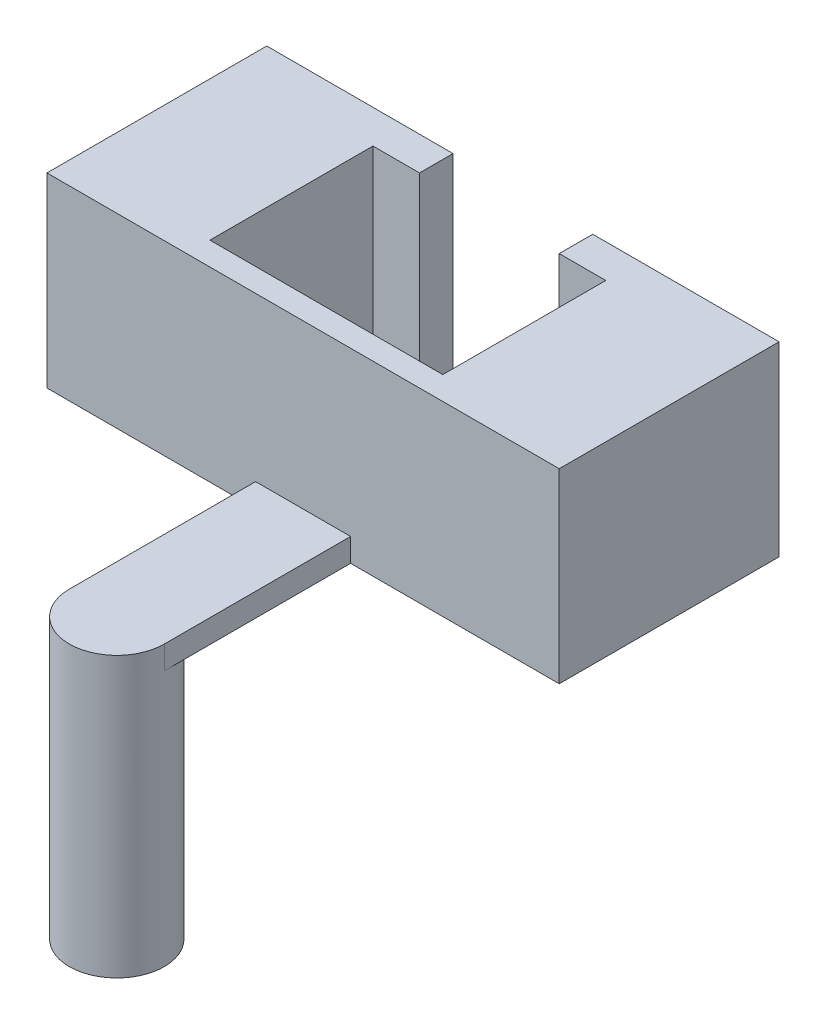
ISO-10303-21;
HEADER;
FILE_DESCRIPTION(('STEP AP214'),'2;1');
FILE_NAME('part.step','',(''),(''),'','','');
FILE_SCHEMA(('AUTOMOTIVE_DESIGN { 1 0 10303 214 1 1 1 1 }'));
ENDSEC;
DATA;
#1=APPLICATION_CONTEXT('core data for automotive mechanical design processes');
#2=APPLICATION_PROTOCOL_DEFINITION('international standard','automotive_design',2000,#1);
#3=PRODUCT_CONTEXT('',#1,'mechanical');
#4=PRODUCT('Part','Part','',(#3));
#5=PRODUCT_RELATED_PRODUCT_CATEGORY('part','',(#4));
#6=PRODUCT_DEFINITION_FORMATION('','',#4);
#7=PRODUCT_DEFINITION_CONTEXT('part definition',#1,'design');
#8=PRODUCT_DEFINITION('design','',#6,#7);
#9=PRODUCT_DEFINITION_SHAPE('','',#8);
#10=(LENGTH_UNIT() NAMED_UNIT(*) SI_UNIT(.MILLI.,.METRE.));
#11=(NAMED_UNIT(*) PLANE_ANGLE_UNIT() SI_UNIT($,.RADIAN.));
#12=(NAMED_UNIT(*) SI_UNIT($,.STERADIAN.) SOLID_ANGLE_UNIT());
#13=UNCERTAINTY_MEASURE_WITH_UNIT(LENGTH_MEASURE(1.E-05),#10,'distance_accuracy_value','');
#14=(GEOMETRIC_REPRESENTATION_CONTEXT(3) GLOBAL_UNCERTAINTY_ASSIGNED_CONTEXT((#13)) GLOBAL_UNIT_ASSIGNED_CONTEXT((#10,
#11,#12)) REPRESENTATION_CONTEXT('',''));
#15=CARTESIAN_POINT('',(0.,0.,0.));
#16=DIRECTION('',(0.,0.,1.));
#17=DIRECTION('',(1.,0.,0.));
#18=AXIS2_PLACEMENT_3D('',#15,#16,#17);
#19=CARTESIAN_POINT('',(-1.73411216451389,76.2,-7.70716517561729));
#20=DIRECTION('',(0.,-1.,0.));
#21=DIRECTION('',(0.,0.,-1.));
#22=AXIS2_PLACEMENT_3D('',#19,#20,#21);
#23=CYLINDRICAL_SURFACE('',#22,12.954);
#24=CARTESIAN_POINT('',(-1.73411216451389,76.2,-7.70716517561729));
#25=DIRECTION('',(0.,1.,0.));
#26=DIRECTION('',(0.,0.,1.));
#27=AXIS2_PLACEMENT_3D('',#24,#25,#26);
#28=CIRCLE('',#27,12.954);
#29=CARTESIAN_POINT('',(-14.6881121645139,76.2,-7.70716517561729));
#30=VERTEX_POINT('',#29);
#31=CARTESIAN_POINT('',(11.2198878354861,76.2,-7.70716517561729));
#32=VERTEX_POINT('',#31);
#33=EDGE_CURVE('E56',#30,#32,#28,.T.);
#34=ORIENTED_EDGE('',*,*,#33,.F.);
#35=DIRECTION('',(0.,1.,0.));
#36=VECTOR('',#35,1.);
#37=CARTESIAN_POINT('',(-14.6881121645139,69.85,-7.70716517561729));
#38=LINE('',#37,#36);
#39=CARTESIAN_POINT('',(-14.6881121645139,69.85,-7.70716517561729));
#40=VERTEX_POINT('',#39);
#41=EDGE_CURVE('E233',#40,#30,#38,.T.);
#42=ORIENTED_EDGE('',*,*,#41,.F.);
#43=CARTESIAN_POINT('',(-1.73411216451389,69.85,-7.70716517561729));
#44=DIRECTION('',(0.,-1.,0.));
#45=DIRECTION('',(0.,0.,-1.));
#46=AXIS2_PLACEMENT_3D('',#43,#44,#45);
#47=CIRCLE('',#46,12.954);
#48=CARTESIAN_POINT('',(11.2198878354861,69.85,-7.70716517561729));
#49=VERTEX_POINT('',#48);
#50=EDGE_CURVE('E12',#40,#49,#47,.T.);
#51=ORIENTED_EDGE('',*,*,#50,.T.);
#52=DIRECTION('',(0.,1.,0.));
#53=VECTOR('',#52,1.);
#54=CARTESIAN_POINT('',(11.2198878354861,69.85,-7.70716517561729));
#55=LINE('',#54,#53);
#56=EDGE_CURVE('E386',#49,#32,#55,.T.);
#57=ORIENTED_EDGE('',*,*,#56,.T.);
#58=EDGE_LOOP('',(#34,#42,#51,#57));
#59=FACE_BOUND('',#58,.T.);
#60=CARTESIAN_POINT('',(-1.73411216451389,0.,-7.70716517561729));
#61=DIRECTION('',(0.,1.,0.));
#62=DIRECTION('',(0.,0.,1.));
#63=AXIS2_PLACEMENT_3D('',#60,#61,#62);
#64=CIRCLE('',#63,12.954);
#65=CARTESIAN_POINT('',(-1.73411216451389,0.,5.24683482438271));
#66=VERTEX_POINT('',#65);
#67=EDGE_CURVE('E396',#66,#66,#64,.T.);
#68=ORIENTED_EDGE('',*,*,#67,.T.);
#69=EDGE_LOOP('',(#68));
#70=FACE_BOUND('',#69,.T.);
#71=ADVANCED_FACE('F49',(#59,#70),#23,.T.);
#72=CARTESIAN_POINT('',(-1.73411216451389,76.2,-7.70716517561729));
#73=DIRECTION('',(0.,1.,0.));
#74=DIRECTION('',(0.,0.,1.));
#75=AXIS2_PLACEMENT_3D('',#72,#73,#74);
#76=PLANE('',#75);
#77=ORIENTED_EDGE('',*,*,#33,.T.);
#78=DIRECTION('',(0.,0.,-1.));
#79=VECTOR('',#78,1.);
#80=CARTESIAN_POINT('',(11.2198878354861,76.2,-7.70716517561729));
#81=LINE('',#80,#79);
#82=CARTESIAN_POINT('',(11.2198878354861,76.2,-58.5071651756173));
#83=VERTEX_POINT('',#82);
#84=EDGE_CURVE('E410',#32,#83,#81,.T.);
#85=ORIENTED_EDGE('',*,*,#84,.T.);
#86=DIRECTION('',(-1.,0.,0.));
#87=VECTOR('',#86,1.);
#88=CARTESIAN_POINT('',(-14.6881121645139,76.2,-58.5071651756173));
#89=LINE('',#88,#87);
#90=CARTESIAN_POINT('',(-14.6881121645139,76.2,-58.5071651756173));
#91=VERTEX_POINT('',#90);
#92=EDGE_CURVE('E229',#83,#91,#89,.T.);
#93=ORIENTED_EDGE('',*,*,#92,.T.);
#94=DIRECTION('',(0.,0.,1.));
#95=VECTOR('',#94,1.);
#96=CARTESIAN_POINT('',(-14.6881121645139,76.2,-7.70716517561729));
#97=LINE('',#96,#95);
#98=EDGE_CURVE('E235',#91,#30,#97,.T.);
#99=ORIENTED_EDGE('',*,*,#98,.T.);
#100=EDGE_LOOP('',(#77,#85,#93,#99));
#101=FACE_BOUND('',#100,.T.);
#102=ADVANCED_FACE('F411',(#101),#76,.T.);
#103=CARTESIAN_POINT('',(-1.73411216451389,0.,-7.70716517561729));
#104=DIRECTION('',(0.,1.,0.));
#105=DIRECTION('',(0.,0.,1.));
#106=AXIS2_PLACEMENT_3D('',#103,#104,#105);
#107=PLANE('',#106);
#108=ORIENTED_EDGE('',*,*,#67,.F.);
#109=EDGE_LOOP('',(#108));
#110=FACE_BOUND('',#109,.T.);
#111=ADVANCED_FACE('F414',(#110),#107,.F.);
#112=CARTESIAN_POINT('',(-14.6881121645139,69.85,-7.70716517561729));
#113=DIRECTION('',(-1.,0.,0.));
#114=DIRECTION('',(0.,0.,1.));
#115=AXIS2_PLACEMENT_3D('',#112,#113,#114);
#116=PLANE('',#115);
#117=ORIENTED_EDGE('',*,*,#98,.F.);
#118=DIRECTION('',(0.,1.,0.));
#119=VECTOR('',#118,1.);
#120=CARTESIAN_POINT('',(-14.6881121645139,69.85,-58.5071651756173));
#121=LINE('',#120,#119);
#122=CARTESIAN_POINT('',(-14.6881121645139,69.85,-58.5071651756173));
#123=VERTEX_POINT('',#122);
#124=EDGE_CURVE('E73',#123,#91,#121,.T.);
#125=ORIENTED_EDGE('',*,*,#124,.F.);
#126=DIRECTION('',(0.,0.,1.));
#127=VECTOR('',#126,1.);
#128=CARTESIAN_POINT('',(-14.6881121645139,69.85,-7.70716517561729));
#129=LINE('',#128,#127);
#130=EDGE_CURVE('E221',#123,#40,#129,.T.);
#131=ORIENTED_EDGE('',*,*,#130,.T.);
#132=ORIENTED_EDGE('',*,*,#41,.T.);
#133=EDGE_LOOP('',(#117,#125,#131,#132));
#134=FACE_BOUND('',#133,.T.);
#135=ADVANCED_FACE('F381',(#134),#116,.T.);
#136=CARTESIAN_POINT('',(11.2198878354861,69.85,-7.70716517561729));
#137=DIRECTION('',(1.,0.,0.));
#138=DIRECTION('',(0.,0.,-1.));
#139=AXIS2_PLACEMENT_3D('',#136,#137,#138);
#140=PLANE('',#139);
#141=ORIENTED_EDGE('',*,*,#84,.F.);
#142=ORIENTED_EDGE('',*,*,#56,.F.);
#143=DIRECTION('',(0.,0.,-1.));
#144=VECTOR('',#143,1.);
#145=CARTESIAN_POINT('',(11.2198878354861,69.85,-7.70716517561729));
#146=LINE('',#145,#144);
#147=CARTESIAN_POINT('',(11.2198878354861,69.85,-58.5071651756173));
#148=VERTEX_POINT('',#147);
#149=EDGE_CURVE('E66',#49,#148,#146,.T.);
#150=ORIENTED_EDGE('',*,*,#149,.T.);
#151=DIRECTION('',(0.,1.,0.));
#152=VECTOR('',#151,1.);
#153=CARTESIAN_POINT('',(11.2198878354861,69.85,-58.5071651756173));
#154=LINE('',#153,#152);
#155=EDGE_CURVE('E93',#148,#83,#154,.T.);
#156=ORIENTED_EDGE('',*,*,#155,.T.);
#157=EDGE_LOOP('',(#141,#142,#150,#156));
#158=FACE_BOUND('',#157,.T.);
#159=ADVANCED_FACE('F421',(#158),#140,.T.);
#160=CARTESIAN_POINT('',(0.,69.85,0.));
#161=DIRECTION('',(0.,-1.,0.));
#162=DIRECTION('',(0.,0.,-1.));
#163=AXIS2_PLACEMENT_3D('',#160,#161,#162);
#164=PLANE('',#163);
#165=ORIENTED_EDGE('',*,*,#50,.F.);
#166=ORIENTED_EDGE('',*,*,#130,.F.);
#167=DIRECTION('',(-1.,0.,0.));
#168=VECTOR('',#167,1.);
#169=CARTESIAN_POINT('',(30.0158878354861,69.85,-58.5071651756173));
#170=LINE('',#169,#168);
#171=CARTESIAN_POINT('',(-71.5841121645139,69.85,-58.5071651756173));
#172=VERTEX_POINT('',#171);
#173=EDGE_CURVE('E246',#123,#172,#170,.T.);
#174=ORIENTED_EDGE('',*,*,#173,.T.);
#175=DIRECTION('',(0.,0.,-1.));
#176=VECTOR('',#175,1.);
#177=CARTESIAN_POINT('',(-71.5841121645139,69.85,-58.5071651756173));
#178=LINE('',#177,#176);
#179=CARTESIAN_POINT('',(-71.5841121645139,69.85,-118.451165175617));
#180=VERTEX_POINT('',#179);
#181=EDGE_CURVE('E288',#172,#180,#178,.T.);
#182=ORIENTED_EDGE('',*,*,#181,.T.);
#183=DIRECTION('',(-1.,0.,0.));
#184=VECTOR('',#183,1.);
#185=CARTESIAN_POINT('',(-71.5841121645139,69.85,-118.451165175617));
#186=LINE('',#185,#184);
#187=CARTESIAN_POINT('',(-20.7841121645139,69.85,-118.451165175617));
#188=VERTEX_POINT('',#187);
#189=EDGE_CURVE('E309',#188,#180,#186,.T.);
#190=ORIENTED_EDGE('',*,*,#189,.F.);
#191=DIRECTION('',(0.,0.,1.));
#192=VECTOR('',#191,1.);
#193=CARTESIAN_POINT('',(-20.7841121645139,69.85,-118.451165175617));
#194=LINE('',#193,#192);
#195=CARTESIAN_POINT('',(-20.7841121645139,69.85,-109.307165175617));
#196=VERTEX_POINT('',#195);
#197=EDGE_CURVE('E312',#188,#196,#194,.T.);
#198=ORIENTED_EDGE('',*,*,#197,.T.);
#199=DIRECTION('',(-1.,0.,0.));
#200=VECTOR('',#199,1.);
#201=CARTESIAN_POINT('',(-71.5841121645139,69.85,-109.307165175617));
#202=LINE('',#201,#200);
#203=CARTESIAN_POINT('',(-33.4841121645139,69.85,-109.307165175617));
#204=VERTEX_POINT('',#203);
#205=EDGE_CURVE('E303',#196,#204,#202,.T.);
#206=ORIENTED_EDGE('',*,*,#205,.T.);
#207=DIRECTION('',(0.,0.,1.));
#208=VECTOR('',#207,1.);
#209=CARTESIAN_POINT('',(-33.4841121645139,69.85,-58.5071651756173));
#210=LINE('',#209,#208);
#211=CARTESIAN_POINT('',(-33.4841121645139,69.85,-64.8571651756173));
#212=VERTEX_POINT('',#211);
#213=EDGE_CURVE('E272',#204,#212,#210,.T.);
#214=ORIENTED_EDGE('',*,*,#213,.T.);
#215=DIRECTION('',(-1.,0.,0.));
#216=VECTOR('',#215,1.);
#217=CARTESIAN_POINT('',(30.0158878354861,69.85,-64.8571651756173));
#218=LINE('',#217,#216);
#219=CARTESIAN_POINT('',(30.0158878354861,69.85,-64.8571651756173));
#220=VERTEX_POINT('',#219);
#221=EDGE_CURVE('E258',#220,#212,#218,.T.);
#222=ORIENTED_EDGE('',*,*,#221,.F.);
#223=DIRECTION('',(0.,0.,-1.));
#224=VECTOR('',#223,1.);
#225=CARTESIAN_POINT('',(30.0158878354861,69.85,-58.5071651756173));
#226=LINE('',#225,#224);
#227=CARTESIAN_POINT('',(30.0158878354861,69.85,-109.307165175617));
#228=VERTEX_POINT('',#227);
#229=EDGE_CURVE('E180',#220,#228,#226,.T.);
#230=ORIENTED_EDGE('',*,*,#229,.T.);
#231=DIRECTION('',(-1.,0.,0.));
#232=VECTOR('',#231,1.);
#233=CARTESIAN_POINT('',(68.1158878354861,69.85,-109.307165175617));
#234=LINE('',#233,#232);
#235=CARTESIAN_POINT('',(17.3158878354861,69.85,-109.307165175617));
#236=VERTEX_POINT('',#235);
#237=EDGE_CURVE('E209',#228,#236,#234,.T.);
#238=ORIENTED_EDGE('',*,*,#237,.T.);
#239=DIRECTION('',(0.,0.,1.));
#240=VECTOR('',#239,1.);
#241=CARTESIAN_POINT('',(17.3158878354861,69.85,-118.451165175617));
#242=LINE('',#241,#240);
#243=CARTESIAN_POINT('',(17.3158878354861,69.85,-118.451165175617));
#244=VERTEX_POINT('',#243);
#245=EDGE_CURVE('E190',#244,#236,#242,.T.);
#246=ORIENTED_EDGE('',*,*,#245,.F.);
#247=DIRECTION('',(-1.,0.,0.));
#248=VECTOR('',#247,1.);
#249=CARTESIAN_POINT('',(68.1158878354861,69.85,-118.451165175617));
#250=LINE('',#249,#248);
#251=CARTESIAN_POINT('',(68.1158878354861,69.85,-118.451165175617));
#252=VERTEX_POINT('',#251);
#253=EDGE_CURVE('E184',#252,#244,#250,.T.);
#254=ORIENTED_EDGE('',*,*,#253,.F.);
#255=DIRECTION('',(0.,0.,1.));
#256=VECTOR('',#255,1.);
#257=CARTESIAN_POINT('',(68.1158878354861,69.85,-58.5071651756173));
#258=LINE('',#257,#256);
#259=CARTESIAN_POINT('',(68.1158878354861,69.85,-58.5071651756173));
#260=VERTEX_POINT('',#259);
#261=EDGE_CURVE('E172',#252,#260,#258,.T.);
#262=ORIENTED_EDGE('',*,*,#261,.T.);
#263=EDGE_CURVE('E245',#260,#148,#170,.T.);
#264=ORIENTED_EDGE('',*,*,#263,.T.);
#265=ORIENTED_EDGE('',*,*,#149,.F.);
#266=EDGE_LOOP('',(#165,#166,#174,#182,#190,#198,#206,#214,#222,#230,#238,#246,#254,#262,#264,#265));
#267=FACE_BOUND('',#266,.T.);
#268=ADVANCED_FACE('F183',(#267),#164,.T.);
#269=CARTESIAN_POINT('',(30.0158878354861,120.65,-64.8571651756173));
#270=DIRECTION('',(0.,-1.,0.));
#271=DIRECTION('',(0.,0.,-1.));
#272=AXIS2_PLACEMENT_3D('',#269,#270,#271);
#273=PLANE('',#272);
#274=DIRECTION('',(1.,0.,0.));
#275=VECTOR('',#274,1.);
#276=CARTESIAN_POINT('',(30.0158878354861,120.65,-58.5071651756173));
#277=LINE('',#276,#275);
#278=CARTESIAN_POINT('',(-71.5841121645139,120.65,-58.5071651756173));
#279=VERTEX_POINT('',#278);
#280=CARTESIAN_POINT('',(68.1158878354861,120.65,-58.5071651756173));
#281=VERTEX_POINT('',#280);
#282=EDGE_CURVE('E226',#279,#281,#277,.T.);
#283=ORIENTED_EDGE('',*,*,#282,.T.);
#284=DIRECTION('',(0.,0.,1.));
#285=VECTOR('',#284,1.);
#286=CARTESIAN_POINT('',(68.1158878354861,120.65,-58.5071651756173));
#287=LINE('',#286,#285);
#288=CARTESIAN_POINT('',(68.1158878354861,120.65,-118.451165175617));
#289=VERTEX_POINT('',#288);
#290=EDGE_CURVE('E270',#289,#281,#287,.T.);
#291=ORIENTED_EDGE('',*,*,#290,.F.);
#292=DIRECTION('',(1.,0.,0.));
#293=VECTOR('',#292,1.);
#294=CARTESIAN_POINT('',(68.1158878354861,120.65,-118.451165175617));
#295=LINE('',#294,#293);
#296=CARTESIAN_POINT('',(17.3158878354861,120.65,-118.451165175617));
#297=VERTEX_POINT('',#296);
#298=EDGE_CURVE('E198',#297,#289,#295,.T.);
#299=ORIENTED_EDGE('',*,*,#298,.F.);
#300=DIRECTION('',(0.,0.,1.));
#301=VECTOR('',#300,1.);
#302=CARTESIAN_POINT('',(17.3158878354861,120.65,-118.451165175617));
#303=LINE('',#302,#301);
#304=CARTESIAN_POINT('',(17.3158878354861,120.65,-109.307165175617));
#305=VERTEX_POINT('',#304);
#306=EDGE_CURVE('E207',#297,#305,#303,.T.);
#307=ORIENTED_EDGE('',*,*,#306,.T.);
#308=DIRECTION('',(1.,0.,0.));
#309=VECTOR('',#308,1.);
#310=CARTESIAN_POINT('',(68.1158878354861,120.65,-109.307165175617));
#311=LINE('',#310,#309);
#312=CARTESIAN_POINT('',(30.0158878354861,120.65,-109.307165175617));
#313=VERTEX_POINT('',#312);
#314=EDGE_CURVE('E196',#305,#313,#311,.T.);
#315=ORIENTED_EDGE('',*,*,#314,.T.);
#316=DIRECTION('',(0.,0.,-1.));
#317=VECTOR('',#316,1.);
#318=CARTESIAN_POINT('',(30.0158878354861,120.65,-58.5071651756173));
#319=LINE('',#318,#317);
#320=CARTESIAN_POINT('',(30.0158878354861,120.65,-64.8571651756173));
#321=VERTEX_POINT('',#320);
#322=EDGE_CURVE('E182',#321,#313,#319,.T.);
#323=ORIENTED_EDGE('',*,*,#322,.F.);
#324=DIRECTION('',(1.,0.,0.));
#325=VECTOR('',#324,1.);
#326=CARTESIAN_POINT('',(30.0158878354861,120.65,-64.8571651756173));
#327=LINE('',#326,#325);
#328=CARTESIAN_POINT('',(-33.4841121645139,120.65,-64.8571651756173));
#329=VERTEX_POINT('',#328);
#330=EDGE_CURVE('E247',#329,#321,#327,.T.);
#331=ORIENTED_EDGE('',*,*,#330,.F.);
#332=DIRECTION('',(0.,0.,1.));
#333=VECTOR('',#332,1.);
#334=CARTESIAN_POINT('',(-33.4841121645139,120.65,-58.5071651756173));
#335=LINE('',#334,#333);
#336=CARTESIAN_POINT('',(-33.4841121645139,120.65,-109.307165175617));
#337=VERTEX_POINT('',#336);
#338=EDGE_CURVE('E295',#337,#329,#335,.T.);
#339=ORIENTED_EDGE('',*,*,#338,.F.);
#340=DIRECTION('',(1.,0.,0.));
#341=VECTOR('',#340,1.);
#342=CARTESIAN_POINT('',(-71.5841121645139,120.65,-109.307165175617));
#343=LINE('',#342,#341);
#344=CARTESIAN_POINT('',(-20.7841121645139,120.65,-109.307165175617));
#345=VERTEX_POINT('',#344);
#346=EDGE_CURVE('E212',#337,#345,#343,.T.);
#347=ORIENTED_EDGE('',*,*,#346,.T.);
#348=DIRECTION('',(0.,0.,1.));
#349=VECTOR('',#348,1.);
#350=CARTESIAN_POINT('',(-20.7841121645139,120.65,-118.451165175617));
#351=LINE('',#350,#349);
#352=CARTESIAN_POINT('',(-20.7841121645139,120.65,-118.451165175617));
#353=VERTEX_POINT('',#352);
#354=EDGE_CURVE('E328',#353,#345,#351,.T.);
#355=ORIENTED_EDGE('',*,*,#354,.F.);
#356=DIRECTION('',(1.,0.,0.));
#357=VECTOR('',#356,1.);
#358=CARTESIAN_POINT('',(-71.5841121645139,120.65,-118.451165175617));
#359=LINE('',#358,#357);
#360=CARTESIAN_POINT('',(-71.5841121645139,120.65,-118.451165175617));
#361=VERTEX_POINT('',#360);
#362=EDGE_CURVE('E305',#361,#353,#359,.T.);
#363=ORIENTED_EDGE('',*,*,#362,.F.);
#364=DIRECTION('',(0.,0.,-1.));
#365=VECTOR('',#364,1.);
#366=CARTESIAN_POINT('',(-71.5841121645139,120.65,-58.5071651756173));
#367=LINE('',#366,#365);
#368=EDGE_CURVE('E281',#279,#361,#367,.T.);
#369=ORIENTED_EDGE('',*,*,#368,.F.);
#370=EDGE_LOOP('',(#283,#291,#299,#307,#315,#323,#331,#339,#347,#355,#363,#369));
#371=FACE_BOUND('',#370,.T.);
#372=ADVANCED_FACE('F336',(#371),#273,.F.);
#373=CARTESIAN_POINT('',(0.,0.,-64.8571651756173));
#374=DIRECTION('',(0.,0.,-1.));
#375=DIRECTION('',(-1.,0.,0.));
#376=AXIS2_PLACEMENT_3D('',#373,#374,#375);
#377=PLANE('',#376);
#378=DIRECTION('',(0.,-1.,0.));
#379=VECTOR('',#378,1.);
#380=CARTESIAN_POINT('',(30.0158878354861,120.65,-64.8571651756173));
#381=LINE('',#380,#379);
#382=EDGE_CURVE('E257',#321,#220,#381,.T.);
#383=ORIENTED_EDGE('',*,*,#382,.T.);
#384=ORIENTED_EDGE('',*,*,#221,.T.);
#385=DIRECTION('',(0.,1.,0.));
#386=VECTOR('',#385,1.);
#387=CARTESIAN_POINT('',(-33.4841121645139,120.65,-64.8571651756173));
#388=LINE('',#387,#386);
#389=EDGE_CURVE('E252',#212,#329,#388,.T.);
#390=ORIENTED_EDGE('',*,*,#389,.T.);
#391=ORIENTED_EDGE('',*,*,#330,.T.);
#392=EDGE_LOOP('',(#383,#384,#390,#391));
#393=FACE_BOUND('',#392,.T.);
#394=ADVANCED_FACE('F355',(#393),#377,.T.);
#395=CARTESIAN_POINT('',(0.,0.,-58.5071651756173));
#396=DIRECTION('',(0.,0.,-1.));
#397=DIRECTION('',(-1.,0.,0.));
#398=AXIS2_PLACEMENT_3D('',#395,#396,#397);
#399=PLANE('',#398);
#400=ORIENTED_EDGE('',*,*,#155,.F.);
#401=ORIENTED_EDGE('',*,*,#263,.F.);
#402=DIRECTION('',(0.,-1.,0.));
#403=VECTOR('',#402,1.);
#404=CARTESIAN_POINT('',(68.1158878354861,120.65,-58.5071651756173));
#405=LINE('',#404,#403);
#406=EDGE_CURVE('E179',#281,#260,#405,.T.);
#407=ORIENTED_EDGE('',*,*,#406,.F.);
#408=ORIENTED_EDGE('',*,*,#282,.F.);
#409=DIRECTION('',(0.,-1.,0.));
#410=VECTOR('',#409,1.);
#411=CARTESIAN_POINT('',(-71.5841121645139,120.65,-58.5071651756173));
#412=LINE('',#411,#410);
#413=EDGE_CURVE('E278',#279,#172,#412,.T.);
#414=ORIENTED_EDGE('',*,*,#413,.T.);
#415=ORIENTED_EDGE('',*,*,#173,.F.);
#416=ORIENTED_EDGE('',*,*,#124,.T.);
#417=ORIENTED_EDGE('',*,*,#92,.F.);
#418=EDGE_LOOP('',(#400,#401,#407,#408,#414,#415,#416,#417));
#419=FACE_BOUND('',#418,.T.);
#420=ADVANCED_FACE('F380',(#419),#399,.F.);
#421=CARTESIAN_POINT('',(-33.4841121645139,120.65,-58.5071651756173));
#422=DIRECTION('',(1.,0.,0.));
#423=DIRECTION('',(0.,0.,-1.));
#424=AXIS2_PLACEMENT_3D('',#421,#422,#423);
#425=PLANE('',#424);
#426=ORIENTED_EDGE('',*,*,#389,.F.);
#427=ORIENTED_EDGE('',*,*,#213,.F.);
#428=DIRECTION('',(0.,-1.,0.));
#429=VECTOR('',#428,1.);
#430=CARTESIAN_POINT('',(-33.4841121645139,120.65,-109.307165175617));
#431=LINE('',#430,#429);
#432=EDGE_CURVE('E284',#337,#204,#431,.T.);
#433=ORIENTED_EDGE('',*,*,#432,.F.);
#434=ORIENTED_EDGE('',*,*,#338,.T.);
#435=EDGE_LOOP('',(#426,#427,#433,#434));
#436=FACE_BOUND('',#435,.T.);
#437=ADVANCED_FACE('F354',(#436),#425,.T.);
#438=CARTESIAN_POINT('',(-71.5841121645139,120.65,-58.5071651756173));
#439=DIRECTION('',(-1.,0.,0.));
#440=DIRECTION('',(0.,0.,1.));
#441=AXIS2_PLACEMENT_3D('',#438,#439,#440);
#442=PLANE('',#441);
#443=ORIENTED_EDGE('',*,*,#181,.F.);
#444=ORIENTED_EDGE('',*,*,#413,.F.);
#445=ORIENTED_EDGE('',*,*,#368,.T.);
#446=DIRECTION('',(0.,1.,0.));
#447=VECTOR('',#446,1.);
#448=CARTESIAN_POINT('',(-71.5841121645139,120.65,-118.451165175617));
#449=LINE('',#448,#447);
#450=EDGE_CURVE('E296',#180,#361,#449,.T.);
#451=ORIENTED_EDGE('',*,*,#450,.F.);
#452=EDGE_LOOP('',(#443,#444,#445,#451));
#453=FACE_BOUND('',#452,.T.);
#454=ADVANCED_FACE('F372',(#453),#442,.T.);
#455=CARTESIAN_POINT('',(30.0158878354861,120.65,-58.5071651756173));
#456=DIRECTION('',(-1.,0.,0.));
#457=DIRECTION('',(0.,0.,1.));
#458=AXIS2_PLACEMENT_3D('',#455,#456,#457);
#459=PLANE('',#458);
#460=ORIENTED_EDGE('',*,*,#382,.F.);
#461=ORIENTED_EDGE('',*,*,#322,.T.);
#462=DIRECTION('',(0.,-1.,0.));
#463=VECTOR('',#462,1.);
#464=CARTESIAN_POINT('',(30.0158878354861,120.65,-109.307165175617));
#465=LINE('',#464,#463);
#466=EDGE_CURVE('E269',#313,#228,#465,.T.);
#467=ORIENTED_EDGE('',*,*,#466,.T.);
#468=ORIENTED_EDGE('',*,*,#229,.F.);
#469=EDGE_LOOP('',(#460,#461,#467,#468));
#470=FACE_BOUND('',#469,.T.);
#471=ADVANCED_FACE('F350',(#470),#459,.T.);
#472=CARTESIAN_POINT('',(68.1158878354861,120.65,-58.5071651756173));
#473=DIRECTION('',(1.,0.,0.));
#474=DIRECTION('',(0.,0.,-1.));
#475=AXIS2_PLACEMENT_3D('',#472,#473,#474);
#476=PLANE('',#475);
#477=ORIENTED_EDGE('',*,*,#261,.F.);
#478=DIRECTION('',(0.,-1.,0.));
#479=VECTOR('',#478,1.);
#480=CARTESIAN_POINT('',(68.1158878354861,120.65,-118.451165175617));
#481=LINE('',#480,#479);
#482=EDGE_CURVE('E176',#289,#252,#481,.T.);
#483=ORIENTED_EDGE('',*,*,#482,.F.);
#484=ORIENTED_EDGE('',*,*,#290,.T.);
#485=ORIENTED_EDGE('',*,*,#406,.T.);
#486=EDGE_LOOP('',(#477,#483,#484,#485));
#487=FACE_BOUND('',#486,.T.);
#488=ADVANCED_FACE('F173',(#487),#476,.T.);
#489=CARTESIAN_POINT('',(17.3158878354861,120.65,-118.451165175617));
#490=DIRECTION('',(1.,0.,0.));
#491=DIRECTION('',(0.,1.,0.));
#492=AXIS2_PLACEMENT_3D('',#489,#490,#491);
#493=PLANE('',#492);
#494=DIRECTION('',(0.,1.,0.));
#495=VECTOR('',#494,1.);
#496=CARTESIAN_POINT('',(17.3158878354861,120.65,-109.307165175617));
#497=LINE('',#496,#495);
#498=EDGE_CURVE('E205',#236,#305,#497,.T.);
#499=ORIENTED_EDGE('',*,*,#498,.T.);
#500=ORIENTED_EDGE('',*,*,#306,.F.);
#501=DIRECTION('',(0.,1.,0.));
#502=VECTOR('',#501,1.);
#503=CARTESIAN_POINT('',(17.3158878354861,120.65,-118.451165175617));
#504=LINE('',#503,#502);
#505=EDGE_CURVE('E191',#244,#297,#504,.T.);
#506=ORIENTED_EDGE('',*,*,#505,.F.);
#507=ORIENTED_EDGE('',*,*,#245,.T.);
#508=EDGE_LOOP('',(#499,#500,#506,#507));
#509=FACE_BOUND('',#508,.T.);
#510=ADVANCED_FACE('F434',(#509),#493,.F.);
#511=CARTESIAN_POINT('',(0.,0.,-118.451165175617));
#512=DIRECTION('',(0.,0.,-1.));
#513=DIRECTION('',(-1.,0.,0.));
#514=AXIS2_PLACEMENT_3D('',#511,#512,#513);
#515=PLANE('',#514);
#516=ORIENTED_EDGE('',*,*,#482,.T.);
#517=ORIENTED_EDGE('',*,*,#253,.T.);
#518=ORIENTED_EDGE('',*,*,#505,.T.);
#519=ORIENTED_EDGE('',*,*,#298,.T.);
#520=EDGE_LOOP('',(#516,#517,#518,#519));
#521=FACE_BOUND('',#520,.T.);
#522=ADVANCED_FACE('F193',(#521),#515,.T.);
#523=CARTESIAN_POINT('',(0.,0.,-109.307165175617));
#524=DIRECTION('',(0.,0.,-1.));
#525=DIRECTION('',(-1.,0.,0.));
#526=AXIS2_PLACEMENT_3D('',#523,#524,#525);
#527=PLANE('',#526);
#528=ORIENTED_EDGE('',*,*,#466,.F.);
#529=ORIENTED_EDGE('',*,*,#314,.F.);
#530=ORIENTED_EDGE('',*,*,#498,.F.);
#531=ORIENTED_EDGE('',*,*,#237,.F.);
#532=EDGE_LOOP('',(#528,#529,#530,#531));
#533=FACE_BOUND('',#532,.T.);
#534=ADVANCED_FACE('F345',(#533),#527,.F.);
#535=CARTESIAN_POINT('',(-20.7841121645139,120.65,-118.451165175617));
#536=DIRECTION('',(-1.,0.,0.));
#537=DIRECTION('',(0.,-1.,0.));
#538=AXIS2_PLACEMENT_3D('',#535,#536,#537);
#539=PLANE('',#538);
#540=DIRECTION('',(0.,-1.,0.));
#541=VECTOR('',#540,1.);
#542=CARTESIAN_POINT('',(-20.7841121645139,120.65,-109.307165175617));
#543=LINE('',#542,#541);
#544=EDGE_CURVE('E318',#345,#196,#543,.T.);
#545=ORIENTED_EDGE('',*,*,#544,.T.);
#546=ORIENTED_EDGE('',*,*,#197,.F.);
#547=DIRECTION('',(0.,-1.,0.));
#548=VECTOR('',#547,1.);
#549=CARTESIAN_POINT('',(-20.7841121645139,120.65,-118.451165175617));
#550=LINE('',#549,#548);
#551=EDGE_CURVE('E306',#353,#188,#550,.T.);
#552=ORIENTED_EDGE('',*,*,#551,.F.);
#553=ORIENTED_EDGE('',*,*,#354,.T.);
#554=EDGE_LOOP('',(#545,#546,#552,#553));
#555=FACE_BOUND('',#554,.T.);
#556=ADVANCED_FACE('F368',(#555),#539,.F.);
#557=CARTESIAN_POINT('',(0.,0.,-118.451165175617));
#558=DIRECTION('',(0.,0.,1.));
#559=DIRECTION('',(1.,0.,0.));
#560=AXIS2_PLACEMENT_3D('',#557,#558,#559);
#561=PLANE('',#560);
#562=ORIENTED_EDGE('',*,*,#450,.T.);
#563=ORIENTED_EDGE('',*,*,#362,.T.);
#564=ORIENTED_EDGE('',*,*,#551,.T.);
#565=ORIENTED_EDGE('',*,*,#189,.T.);
#566=EDGE_LOOP('',(#562,#563,#564,#565));
#567=FACE_BOUND('',#566,.T.);
#568=ADVANCED_FACE('F366',(#567),#561,.F.);
#569=CARTESIAN_POINT('',(0.,0.,-109.307165175617));
#570=DIRECTION('',(0.,0.,1.));
#571=DIRECTION('',(1.,0.,0.));
#572=AXIS2_PLACEMENT_3D('',#569,#570,#571);
#573=PLANE('',#572);
#574=ORIENTED_EDGE('',*,*,#346,.F.);
#575=ORIENTED_EDGE('',*,*,#432,.T.);
#576=ORIENTED_EDGE('',*,*,#205,.F.);
#577=ORIENTED_EDGE('',*,*,#544,.F.);
#578=EDGE_LOOP('',(#574,#575,#576,#577));
#579=FACE_BOUND('',#578,.T.);
#580=ADVANCED_FACE('F363',(#579),#573,.T.);
#581=CLOSED_SHELL('',(#71,#102,#111,#135,#159,#268,#372,#394,#420,#437,#454,#471,#488,#510,#522,
#534,#556,#568,#580));
#582=MANIFOLD_SOLID_BREP('B2',#581);
#583=ADVANCED_BREP_SHAPE_REPRESENTATION('',(#18,#582),#14);
#584=SHAPE_DEFINITION_REPRESENTATION(#9,#583);
ENDSEC;
END-ISO-10303-21;
